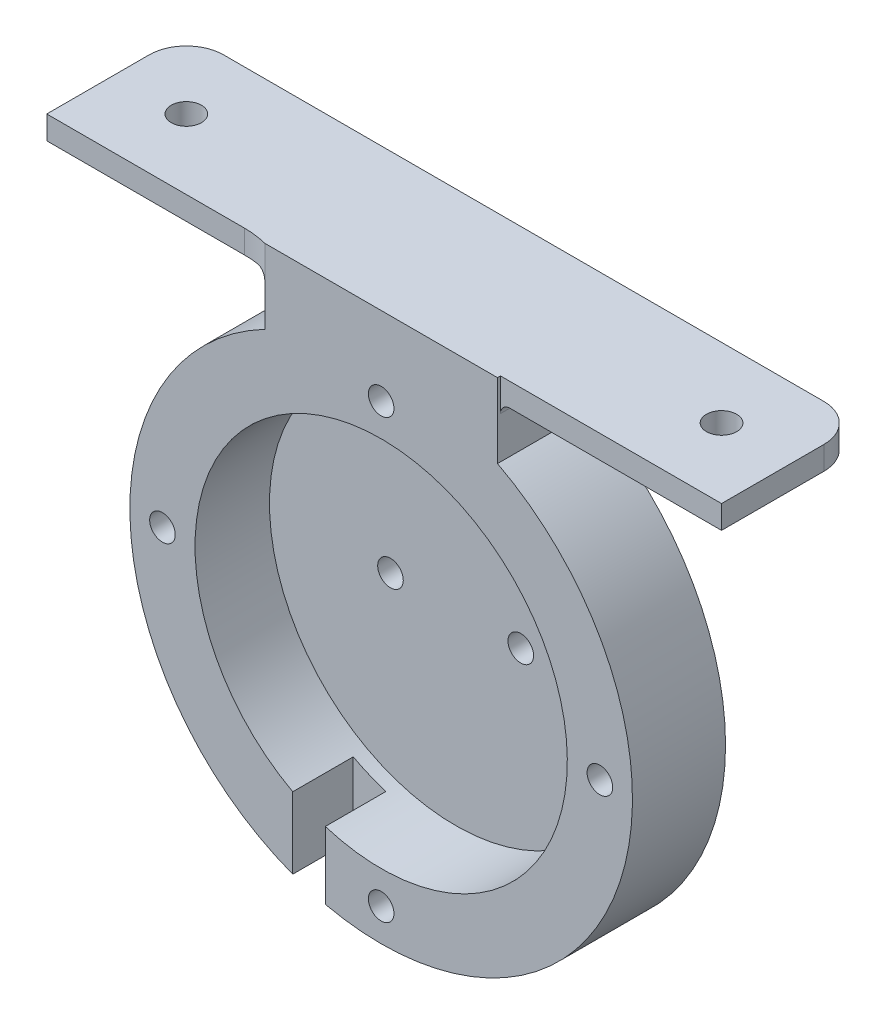
ISO-10303-21;
HEADER;
FILE_DESCRIPTION(('STEP AP214'),'2;1');
FILE_NAME('part.step','',(''),(''),'','','');
FILE_SCHEMA(('AUTOMOTIVE_DESIGN { 1 0 10303 214 1 1 1 1 }'));
ENDSEC;
DATA;
#1=APPLICATION_CONTEXT('core data for automotive mechanical design processes');
#2=APPLICATION_PROTOCOL_DEFINITION('international standard','automotive_design',2000,#1);
#3=PRODUCT_CONTEXT('',#1,'mechanical');
#4=PRODUCT('Part','Part','',(#3));
#5=PRODUCT_RELATED_PRODUCT_CATEGORY('part','',(#4));
#6=PRODUCT_DEFINITION_FORMATION('','',#4);
#7=PRODUCT_DEFINITION_CONTEXT('part definition',#1,'design');
#8=PRODUCT_DEFINITION('design','',#6,#7);
#9=PRODUCT_DEFINITION_SHAPE('','',#8);
#10=(LENGTH_UNIT() NAMED_UNIT(*) SI_UNIT(.MILLI.,.METRE.));
#11=(NAMED_UNIT(*) PLANE_ANGLE_UNIT() SI_UNIT($,.RADIAN.));
#12=(NAMED_UNIT(*) SI_UNIT($,.STERADIAN.) SOLID_ANGLE_UNIT());
#13=UNCERTAINTY_MEASURE_WITH_UNIT(LENGTH_MEASURE(1.E-05),#10,'distance_accuracy_value','');
#14=(GEOMETRIC_REPRESENTATION_CONTEXT(3) GLOBAL_UNCERTAINTY_ASSIGNED_CONTEXT((#13)) GLOBAL_UNIT_ASSIGNED_CONTEXT((#10,
#11,#12)) REPRESENTATION_CONTEXT('',''));
#15=CARTESIAN_POINT('',(0.,0.,0.));
#16=DIRECTION('',(0.,0.,1.));
#17=DIRECTION('',(1.,0.,0.));
#18=AXIS2_PLACEMENT_3D('',#15,#16,#17);
#19=CARTESIAN_POINT('',(-12.5,23.9321958875486,4.));
#20=DIRECTION('',(-1.,0.,0.));
#21=DIRECTION('',(0.,0.,1.));
#22=AXIS2_PLACEMENT_3D('',#19,#20,#21);
#23=PLANE('',#22);
#24=DIRECTION('',(0.,-1.,0.));
#25=VECTOR('',#24,1.);
#26=CARTESIAN_POINT('',(-12.5,23.9321958875486,10.));
#27=LINE('',#26,#25);
#28=CARTESIAN_POINT('',(-12.5,28.4321958875486,10.));
#29=VERTEX_POINT('',#28);
#30=CARTESIAN_POINT('',(-12.5,23.9321958875486,10.));
#31=VERTEX_POINT('',#30);
#32=EDGE_CURVE('E302',#29,#31,#27,.T.);
#33=ORIENTED_EDGE('',*,*,#32,.F.);
#34=DIRECTION('',(0.,0.,1.));
#35=VECTOR('',#34,1.);
#36=CARTESIAN_POINT('',(-12.5,28.4321958875486,4.));
#37=LINE('',#36,#35);
#38=CARTESIAN_POINT('',(-12.5,28.4321958875486,4.));
#39=VERTEX_POINT('',#38);
#40=EDGE_CURVE('E68',#29,#39,#37,.F.);
#41=ORIENTED_EDGE('',*,*,#40,.T.);
#42=DIRECTION('',(0.,-1.,0.));
#43=VECTOR('',#42,1.);
#44=CARTESIAN_POINT('',(-12.5,23.9321958875486,4.));
#45=LINE('',#44,#43);
#46=CARTESIAN_POINT('',(-12.5,23.9321958875486,4.));
#47=VERTEX_POINT('',#46);
#48=EDGE_CURVE('E303',#39,#47,#45,.T.);
#49=ORIENTED_EDGE('',*,*,#48,.T.);
#50=DIRECTION('',(0.,0.,1.));
#51=VECTOR('',#50,1.);
#52=CARTESIAN_POINT('',(-12.5,23.9321958875486,4.));
#53=LINE('',#52,#51);
#54=EDGE_CURVE('E311',#47,#31,#53,.T.);
#55=ORIENTED_EDGE('',*,*,#54,.T.);
#56=EDGE_LOOP('',(#33,#41,#49,#55));
#57=FACE_BOUND('',#56,.T.);
#58=ADVANCED_FACE('F42',(#57),#23,.T.);
#59=CARTESIAN_POINT('',(0.,0.,10.));
#60=DIRECTION('',(0.,0.,1.));
#61=DIRECTION('',(1.,0.,0.));
#62=AXIS2_PLACEMENT_3D('',#59,#60,#61);
#63=PLANE('',#62);
#64=DIRECTION('',(0.,1.,0.));
#65=VECTOR('',#64,1.);
#66=CARTESIAN_POINT('',(12.5,23.9321958875486,10.));
#67=LINE('',#66,#65);
#68=CARTESIAN_POINT('',(12.5,23.9321958875486,10.));
#69=VERTEX_POINT('',#68);
#70=CARTESIAN_POINT('',(12.5,31.9321958875486,10.));
#71=VERTEX_POINT('',#70);
#72=EDGE_CURVE('E314',#69,#71,#67,.T.);
#73=ORIENTED_EDGE('',*,*,#72,.T.);
#74=DIRECTION('',(-1.,0.,0.));
#75=VECTOR('',#74,1.);
#76=CARTESIAN_POINT('',(-12.5,31.9321958875486,10.));
#77=LINE('',#76,#75);
#78=CARTESIAN_POINT('',(-12.5,31.9321958875486,10.));
#79=VERTEX_POINT('',#78);
#80=EDGE_CURVE('E307',#71,#79,#77,.T.);
#81=ORIENTED_EDGE('',*,*,#80,.T.);
#82=EDGE_CURVE('E61',#79,#29,#27,.T.);
#83=ORIENTED_EDGE('',*,*,#82,.T.);
#84=ORIENTED_EDGE('',*,*,#32,.T.);
#85=CARTESIAN_POINT('',(0.,0.,10.));
#86=DIRECTION('',(0.,0.,1.));
#87=DIRECTION('',(1.,0.,0.));
#88=AXIS2_PLACEMENT_3D('',#85,#86,#87);
#89=CIRCLE('',#88,27.);
#90=CARTESIAN_POINT('',(-9.5,-25.2735039122002,10.));
#91=VERTEX_POINT('',#90);
#92=EDGE_CURVE('E383',#31,#91,#89,.T.);
#93=ORIENTED_EDGE('',*,*,#92,.T.);
#94=DIRECTION('',(0.,-1.,0.));
#95=VECTOR('',#94,1.);
#96=CARTESIAN_POINT('',(-9.5,0.,10.));
#97=LINE('',#96,#95);
#98=CARTESIAN_POINT('',(-9.5,-17.599715906798,10.));
#99=VERTEX_POINT('',#98);
#100=EDGE_CURVE('E299',#99,#91,#97,.T.);
#101=ORIENTED_EDGE('',*,*,#100,.F.);
#102=CARTESIAN_POINT('',(0.,0.,10.));
#103=DIRECTION('',(0.,0.,1.));
#104=DIRECTION('',(1.,0.,0.));
#105=AXIS2_PLACEMENT_3D('',#102,#103,#104);
#106=CIRCLE('',#105,20.);
#107=CARTESIAN_POINT('',(-6.,-19.0787840283389,10.));
#108=VERTEX_POINT('',#107);
#109=EDGE_CURVE('E367',#108,#99,#106,.T.);
#110=ORIENTED_EDGE('',*,*,#109,.F.);
#111=DIRECTION('',(0.,1.,0.));
#112=VECTOR('',#111,1.);
#113=CARTESIAN_POINT('',(-6.,0.,10.));
#114=LINE('',#113,#112);
#115=CARTESIAN_POINT('',(-6.,-26.3248931621764,10.));
#116=VERTEX_POINT('',#115);
#117=EDGE_CURVE('E290',#116,#108,#114,.T.);
#118=ORIENTED_EDGE('',*,*,#117,.F.);
#119=EDGE_CURVE('E388',#116,#69,#89,.T.);
#120=ORIENTED_EDGE('',*,*,#119,.T.);
#121=EDGE_LOOP('',(#73,#81,#83,#84,#93,#101,#110,#118,#120));
#122=FACE_BOUND('',#121,.T.);
#123=CARTESIAN_POINT('',(1.327186583295E-12,-23.5,10.));
#124=DIRECTION('',(0.,0.,1.));
#125=DIRECTION('',(1.,0.,0.));
#126=AXIS2_PLACEMENT_3D('',#123,#124,#125);
#127=CIRCLE('',#126,1.375);
#128=CARTESIAN_POINT('',(1.37500000000133,-23.5,10.));
#129=VERTEX_POINT('',#128);
#130=EDGE_CURVE('E355',#129,#129,#127,.T.);
#131=ORIENTED_EDGE('',*,*,#130,.F.);
#132=EDGE_LOOP('',(#131));
#133=FACE_BOUND('',#132,.T.);
#134=CARTESIAN_POINT('',(0.,23.5,10.));
#135=DIRECTION('',(0.,0.,1.));
#136=DIRECTION('',(1.,0.,0.));
#137=AXIS2_PLACEMENT_3D('',#134,#135,#136);
#138=CIRCLE('',#137,1.375);
#139=CARTESIAN_POINT('',(1.375,23.5,10.));
#140=VERTEX_POINT('',#139);
#141=EDGE_CURVE('E375',#140,#140,#138,.T.);
#142=ORIENTED_EDGE('',*,*,#141,.F.);
#143=EDGE_LOOP('',(#142));
#144=FACE_BOUND('',#143,.T.);
#145=CARTESIAN_POINT('',(23.5000000000007,6.635932916475E-13,10.));
#146=DIRECTION('',(0.,0.,1.));
#147=DIRECTION('',(1.,0.,0.));
#148=AXIS2_PLACEMENT_3D('',#145,#146,#147);
#149=CIRCLE('',#148,1.375);
#150=CARTESIAN_POINT('',(24.8750000000007,6.635932916475E-13,10.));
#151=VERTEX_POINT('',#150);
#152=EDGE_CURVE('E363',#151,#151,#149,.T.);
#153=ORIENTED_EDGE('',*,*,#152,.F.);
#154=EDGE_LOOP('',(#153));
#155=FACE_BOUND('',#154,.T.);
#156=CARTESIAN_POINT('',(-23.4999999999993,-6.66471211625496E-13,10.));
#157=DIRECTION('',(0.,0.,1.));
#158=DIRECTION('',(1.,0.,0.));
#159=AXIS2_PLACEMENT_3D('',#156,#157,#158);
#160=CIRCLE('',#159,1.375);
#161=CARTESIAN_POINT('',(-22.1249999999993,-6.66471211625496E-13,10.));
#162=VERTEX_POINT('',#161);
#163=EDGE_CURVE('E347',#162,#162,#160,.T.);
#164=ORIENTED_EDGE('',*,*,#163,.F.);
#165=EDGE_LOOP('',(#164));
#166=FACE_BOUND('',#165,.T.);
#167=ADVANCED_FACE('F465',(#122,#133,#144,#155,#166),#63,.T.);
#168=CARTESIAN_POINT('',(0.,0.,0.));
#169=DIRECTION('',(0.,0.,1.));
#170=DIRECTION('',(1.,0.,0.));
#171=AXIS2_PLACEMENT_3D('',#168,#169,#170);
#172=PLANE('',#171);
#173=CARTESIAN_POINT('',(0.,0.,0.));
#174=DIRECTION('',(0.,0.,1.));
#175=DIRECTION('',(1.,0.,0.));
#176=AXIS2_PLACEMENT_3D('',#173,#174,#175);
#177=CIRCLE('',#176,27.);
#178=CARTESIAN_POINT('',(27.,0.,0.));
#179=VERTEX_POINT('',#178);
#180=EDGE_CURVE('E379',#179,#179,#177,.T.);
#181=ORIENTED_EDGE('',*,*,#180,.F.);
#182=EDGE_LOOP('',(#181));
#183=FACE_BOUND('',#182,.T.);
#184=CARTESIAN_POINT('',(0.,23.5,0.));
#185=DIRECTION('',(0.,0.,1.));
#186=DIRECTION('',(1.,0.,0.));
#187=AXIS2_PLACEMENT_3D('',#184,#185,#186);
#188=CIRCLE('',#187,1.375);
#189=CARTESIAN_POINT('',(1.375,23.5,0.));
#190=VERTEX_POINT('',#189);
#191=EDGE_CURVE('E374',#190,#190,#188,.T.);
#192=ORIENTED_EDGE('',*,*,#191,.T.);
#193=EDGE_LOOP('',(#192));
#194=FACE_BOUND('',#193,.T.);
#195=CARTESIAN_POINT('',(23.5000000000007,6.635932916475E-13,0.));
#196=DIRECTION('',(0.,0.,1.));
#197=DIRECTION('',(1.,0.,0.));
#198=AXIS2_PLACEMENT_3D('',#195,#196,#197);
#199=CIRCLE('',#198,1.375);
#200=CARTESIAN_POINT('',(24.8750000000007,6.635932916475E-13,0.));
#201=VERTEX_POINT('',#200);
#202=EDGE_CURVE('E359',#201,#201,#199,.T.);
#203=ORIENTED_EDGE('',*,*,#202,.T.);
#204=EDGE_LOOP('',(#203));
#205=FACE_BOUND('',#204,.T.);
#206=CARTESIAN_POINT('',(1.327186583295E-12,-23.5,0.));
#207=DIRECTION('',(0.,0.,1.));
#208=DIRECTION('',(1.,0.,0.));
#209=AXIS2_PLACEMENT_3D('',#206,#207,#208);
#210=CIRCLE('',#209,1.375);
#211=CARTESIAN_POINT('',(1.37500000000133,-23.5,0.));
#212=VERTEX_POINT('',#211);
#213=EDGE_CURVE('E351',#212,#212,#210,.T.);
#214=ORIENTED_EDGE('',*,*,#213,.T.);
#215=EDGE_LOOP('',(#214));
#216=FACE_BOUND('',#215,.T.);
#217=CARTESIAN_POINT('',(-23.4999999999993,-6.66471211625496E-13,0.));
#218=DIRECTION('',(0.,0.,1.));
#219=DIRECTION('',(1.,0.,0.));
#220=AXIS2_PLACEMENT_3D('',#217,#218,#219);
#221=CIRCLE('',#220,1.375);
#222=CARTESIAN_POINT('',(-22.1249999999993,-6.66471211625496E-13,0.));
#223=VERTEX_POINT('',#222);
#224=EDGE_CURVE('E343',#223,#223,#221,.T.);
#225=ORIENTED_EDGE('',*,*,#224,.T.);
#226=EDGE_LOOP('',(#225));
#227=FACE_BOUND('',#226,.T.);
#228=CARTESIAN_POINT('',(-7.,0.,0.));
#229=DIRECTION('',(0.,0.,1.));
#230=DIRECTION('',(1.,0.,0.));
#231=AXIS2_PLACEMENT_3D('',#228,#229,#230);
#232=CIRCLE('',#231,1.375);
#233=CARTESIAN_POINT('',(-5.625,0.,0.));
#234=VERTEX_POINT('',#233);
#235=EDGE_CURVE('E335',#234,#234,#232,.T.);
#236=ORIENTED_EDGE('',*,*,#235,.T.);
#237=EDGE_LOOP('',(#236));
#238=FACE_BOUND('',#237,.T.);
#239=CARTESIAN_POINT('',(7.,0.,0.));
#240=DIRECTION('',(0.,0.,1.));
#241=DIRECTION('',(1.,0.,0.));
#242=AXIS2_PLACEMENT_3D('',#239,#240,#241);
#243=CIRCLE('',#242,1.375);
#244=CARTESIAN_POINT('',(8.375,0.,0.));
#245=VERTEX_POINT('',#244);
#246=EDGE_CURVE('E323',#245,#245,#243,.T.);
#247=ORIENTED_EDGE('',*,*,#246,.T.);
#248=EDGE_LOOP('',(#247));
#249=FACE_BOUND('',#248,.T.);
#250=ADVANCED_FACE('F470',(#183,#194,#205,#216,#227,#238,#249),#172,.F.);
#251=CARTESIAN_POINT('',(0.,0.,10.));
#252=DIRECTION('',(0.,0.,-1.));
#253=DIRECTION('',(-1.,0.,0.));
#254=AXIS2_PLACEMENT_3D('',#251,#252,#253);
#255=CYLINDRICAL_SURFACE('',#254,27.);
#256=CARTESIAN_POINT('',(0.,0.,3.49999999999996));
#257=DIRECTION('',(0.,0.,-1.));
#258=DIRECTION('',(-1.,0.,0.));
#259=AXIS2_PLACEMENT_3D('',#256,#257,#258);
#260=CIRCLE('',#259,27.);
#261=CARTESIAN_POINT('',(-9.5,-25.2735039122002,3.49999999999996));
#262=VERTEX_POINT('',#261);
#263=CARTESIAN_POINT('',(-6.,-26.3248931621764,3.49999999999996));
#264=VERTEX_POINT('',#263);
#265=EDGE_CURVE('E283',#262,#264,#260,.F.);
#266=ORIENTED_EDGE('',*,*,#265,.F.);
#267=DIRECTION('',(0.,0.,-1.));
#268=VECTOR('',#267,1.);
#269=CARTESIAN_POINT('',(-9.5,-25.2735039122002,10.));
#270=LINE('',#269,#268);
#271=EDGE_CURVE('E287',#91,#262,#270,.T.);
#272=ORIENTED_EDGE('',*,*,#271,.F.);
#273=ORIENTED_EDGE('',*,*,#92,.F.);
#274=ORIENTED_EDGE('',*,*,#54,.F.);
#275=CARTESIAN_POINT('',(0.,0.,4.));
#276=DIRECTION('',(0.,0.,-1.));
#277=DIRECTION('',(-1.,0.,0.));
#278=AXIS2_PLACEMENT_3D('',#275,#276,#277);
#279=CIRCLE('',#278,27.);
#280=CARTESIAN_POINT('',(12.5,23.9321958875486,4.));
#281=VERTEX_POINT('',#280);
#282=EDGE_CURVE('E395',#47,#281,#279,.T.);
#283=ORIENTED_EDGE('',*,*,#282,.T.);
#284=DIRECTION('',(0.,0.,1.));
#285=VECTOR('',#284,1.);
#286=CARTESIAN_POINT('',(12.5,23.9321958875486,4.));
#287=LINE('',#286,#285);
#288=EDGE_CURVE('E324',#281,#69,#287,.T.);
#289=ORIENTED_EDGE('',*,*,#288,.T.);
#290=ORIENTED_EDGE('',*,*,#119,.F.);
#291=DIRECTION('',(0.,0.,-1.));
#292=VECTOR('',#291,1.);
#293=CARTESIAN_POINT('',(-6.,-26.3248931621764,10.));
#294=LINE('',#293,#292);
#295=EDGE_CURVE('E280',#264,#116,#294,.F.);
#296=ORIENTED_EDGE('',*,*,#295,.F.);
#297=EDGE_LOOP('',(#266,#272,#273,#274,#283,#289,#290,#296));
#298=FACE_BOUND('',#297,.T.);
#299=ORIENTED_EDGE('',*,*,#180,.T.);
#300=EDGE_LOOP('',(#299));
#301=FACE_BOUND('',#300,.T.);
#302=ADVANCED_FACE('F450',(#298,#301),#255,.T.);
#303=CARTESIAN_POINT('',(0.,23.5,10.));
#304=DIRECTION('',(0.,0.,-1.));
#305=DIRECTION('',(-1.,0.,0.));
#306=AXIS2_PLACEMENT_3D('',#303,#304,#305);
#307=CYLINDRICAL_SURFACE('',#306,1.375);
#308=ORIENTED_EDGE('',*,*,#141,.T.);
#309=EDGE_LOOP('',(#308));
#310=FACE_BOUND('',#309,.T.);
#311=ORIENTED_EDGE('',*,*,#191,.F.);
#312=EDGE_LOOP('',(#311));
#313=FACE_BOUND('',#312,.T.);
#314=ADVANCED_FACE('F504',(#310,#313),#307,.F.);
#315=CARTESIAN_POINT('',(0.,0.,10.));
#316=DIRECTION('',(0.,0.,-1.));
#317=DIRECTION('',(-1.,0.,0.));
#318=AXIS2_PLACEMENT_3D('',#315,#316,#317);
#319=CYLINDRICAL_SURFACE('',#318,20.);
#320=DIRECTION('',(0.,0.,-1.));
#321=VECTOR('',#320,1.);
#322=CARTESIAN_POINT('',(-9.5,-17.599715906798,10.));
#323=LINE('',#322,#321);
#324=CARTESIAN_POINT('',(-9.5,-17.599715906798,3.49999999999996));
#325=VERTEX_POINT('',#324);
#326=EDGE_CURVE('E405',#325,#99,#323,.F.);
#327=ORIENTED_EDGE('',*,*,#326,.F.);
#328=CARTESIAN_POINT('',(0.,0.,3.49999999999996));
#329=DIRECTION('',(0.,0.,-1.));
#330=DIRECTION('',(-1.,0.,0.));
#331=AXIS2_PLACEMENT_3D('',#328,#329,#330);
#332=CIRCLE('',#331,20.);
#333=CARTESIAN_POINT('',(-6.,-19.0787840283389,3.49999999999996));
#334=VERTEX_POINT('',#333);
#335=EDGE_CURVE('E402',#334,#325,#332,.T.);
#336=ORIENTED_EDGE('',*,*,#335,.F.);
#337=DIRECTION('',(0.,0.,-1.));
#338=VECTOR('',#337,1.);
#339=CARTESIAN_POINT('',(-6.,-19.0787840283389,10.));
#340=LINE('',#339,#338);
#341=EDGE_CURVE('E399',#108,#334,#340,.T.);
#342=ORIENTED_EDGE('',*,*,#341,.F.);
#343=ORIENTED_EDGE('',*,*,#109,.T.);
#344=EDGE_LOOP('',(#327,#336,#342,#343));
#345=FACE_BOUND('',#344,.T.);
#346=CARTESIAN_POINT('',(0.,0.,2.));
#347=DIRECTION('',(0.,0.,1.));
#348=DIRECTION('',(1.,0.,0.));
#349=AXIS2_PLACEMENT_3D('',#346,#347,#348);
#350=CIRCLE('',#349,20.);
#351=CARTESIAN_POINT('',(20.,0.,2.));
#352=VERTEX_POINT('',#351);
#353=EDGE_CURVE('E387',#352,#352,#350,.T.);
#354=ORIENTED_EDGE('',*,*,#353,.F.);
#355=EDGE_LOOP('',(#354));
#356=FACE_BOUND('',#355,.T.);
#357=ADVANCED_FACE('F500',(#345,#356),#319,.F.);
#358=CARTESIAN_POINT('',(23.5000000000007,6.635932916475E-13,10.));
#359=DIRECTION('',(0.,0.,-1.));
#360=DIRECTION('',(-1.,0.,0.));
#361=AXIS2_PLACEMENT_3D('',#358,#359,#360);
#362=CYLINDRICAL_SURFACE('',#361,1.375);
#363=ORIENTED_EDGE('',*,*,#152,.T.);
#364=EDGE_LOOP('',(#363));
#365=FACE_BOUND('',#364,.T.);
#366=ORIENTED_EDGE('',*,*,#202,.F.);
#367=EDGE_LOOP('',(#366));
#368=FACE_BOUND('',#367,.T.);
#369=ADVANCED_FACE('F496',(#365,#368),#362,.F.);
#370=CARTESIAN_POINT('',(1.327186583295E-12,-23.5,10.));
#371=DIRECTION('',(0.,0.,-1.));
#372=DIRECTION('',(-1.,0.,0.));
#373=AXIS2_PLACEMENT_3D('',#370,#371,#372);
#374=CYLINDRICAL_SURFACE('',#373,1.375);
#375=ORIENTED_EDGE('',*,*,#130,.T.);
#376=EDGE_LOOP('',(#375));
#377=FACE_BOUND('',#376,.T.);
#378=ORIENTED_EDGE('',*,*,#213,.F.);
#379=EDGE_LOOP('',(#378));
#380=FACE_BOUND('',#379,.T.);
#381=ADVANCED_FACE('F492',(#377,#380),#374,.F.);
#382=CARTESIAN_POINT('',(-23.4999999999993,-6.66471211625496E-13,10.));
#383=DIRECTION('',(0.,0.,-1.));
#384=DIRECTION('',(-1.,0.,0.));
#385=AXIS2_PLACEMENT_3D('',#382,#383,#384);
#386=CYLINDRICAL_SURFACE('',#385,1.375);
#387=ORIENTED_EDGE('',*,*,#163,.T.);
#388=EDGE_LOOP('',(#387));
#389=FACE_BOUND('',#388,.T.);
#390=ORIENTED_EDGE('',*,*,#224,.F.);
#391=EDGE_LOOP('',(#390));
#392=FACE_BOUND('',#391,.T.);
#393=ADVANCED_FACE('F488',(#389,#392),#386,.F.);
#394=CARTESIAN_POINT('',(0.,0.,2.));
#395=DIRECTION('',(0.,0.,1.));
#396=DIRECTION('',(1.,0.,0.));
#397=AXIS2_PLACEMENT_3D('',#394,#395,#396);
#398=PLANE('',#397);
#399=CARTESIAN_POINT('',(-7.,0.,2.));
#400=DIRECTION('',(0.,0.,1.));
#401=DIRECTION('',(1.,0.,0.));
#402=AXIS2_PLACEMENT_3D('',#399,#400,#401);
#403=CIRCLE('',#402,1.375);
#404=CARTESIAN_POINT('',(-5.625,0.,2.));
#405=VERTEX_POINT('',#404);
#406=EDGE_CURVE('E339',#405,#405,#403,.T.);
#407=ORIENTED_EDGE('',*,*,#406,.F.);
#408=EDGE_LOOP('',(#407));
#409=FACE_BOUND('',#408,.T.);
#410=ORIENTED_EDGE('',*,*,#353,.T.);
#411=EDGE_LOOP('',(#410));
#412=FACE_BOUND('',#411,.T.);
#413=CARTESIAN_POINT('',(7.,0.,2.));
#414=DIRECTION('',(0.,0.,1.));
#415=DIRECTION('',(1.,0.,0.));
#416=AXIS2_PLACEMENT_3D('',#413,#414,#415);
#417=CIRCLE('',#416,1.375);
#418=CARTESIAN_POINT('',(8.375,0.,2.));
#419=VERTEX_POINT('',#418);
#420=EDGE_CURVE('E331',#419,#419,#417,.T.);
#421=ORIENTED_EDGE('',*,*,#420,.F.);
#422=EDGE_LOOP('',(#421));
#423=FACE_BOUND('',#422,.T.);
#424=ADVANCED_FACE('F484',(#409,#412,#423),#398,.T.);
#425=CARTESIAN_POINT('',(-7.,0.,2.));
#426=DIRECTION('',(0.,0.,-1.));
#427=DIRECTION('',(-1.,0.,0.));
#428=AXIS2_PLACEMENT_3D('',#425,#426,#427);
#429=CYLINDRICAL_SURFACE('',#428,1.375);
#430=ORIENTED_EDGE('',*,*,#406,.T.);
#431=EDGE_LOOP('',(#430));
#432=FACE_BOUND('',#431,.T.);
#433=ORIENTED_EDGE('',*,*,#235,.F.);
#434=EDGE_LOOP('',(#433));
#435=FACE_BOUND('',#434,.T.);
#436=ADVANCED_FACE('F480',(#432,#435),#429,.F.);
#437=CARTESIAN_POINT('',(7.,0.,2.));
#438=DIRECTION('',(0.,0.,-1.));
#439=DIRECTION('',(-1.,0.,0.));
#440=AXIS2_PLACEMENT_3D('',#437,#438,#439);
#441=CYLINDRICAL_SURFACE('',#440,1.375);
#442=ORIENTED_EDGE('',*,*,#420,.T.);
#443=EDGE_LOOP('',(#442));
#444=FACE_BOUND('',#443,.T.);
#445=ORIENTED_EDGE('',*,*,#246,.F.);
#446=EDGE_LOOP('',(#445));
#447=FACE_BOUND('',#446,.T.);
#448=ADVANCED_FACE('F476',(#444,#447),#441,.F.);
#449=CARTESIAN_POINT('',(-12.5,31.9321958875486,4.));
#450=DIRECTION('',(0.,1.,0.));
#451=DIRECTION('',(0.,0.,1.));
#452=AXIS2_PLACEMENT_3D('',#449,#450,#451);
#453=PLANE('',#452);
#454=DIRECTION('',(-1.,0.,0.));
#455=VECTOR('',#454,1.);
#456=CARTESIAN_POINT('',(-12.5,31.9321958875486,-5.32));
#457=LINE('',#456,#455);
#458=CARTESIAN_POINT('',(32.25,31.9321958875486,-5.32));
#459=VERTEX_POINT('',#458);
#460=CARTESIAN_POINT('',(-32.25,31.9321958875486,-5.32));
#461=VERTEX_POINT('',#460);
#462=EDGE_CURVE('E191',#459,#461,#457,.T.);
#463=ORIENTED_EDGE('',*,*,#462,.T.);
#464=CARTESIAN_POINT('',(-32.25,31.9321958875486,-1.31999999999999));
#465=DIRECTION('',(0.,1.,0.));
#466=DIRECTION('',(0.,0.,1.));
#467=AXIS2_PLACEMENT_3D('',#464,#465,#466);
#468=CIRCLE('',#467,3.99999999999999);
#469=CARTESIAN_POINT('',(-36.25,31.9321958875486,-1.31999999999999));
#470=VERTEX_POINT('',#469);
#471=EDGE_CURVE('E259',#470,#461,#468,.F.);
#472=ORIENTED_EDGE('',*,*,#471,.F.);
#473=DIRECTION('',(0.,0.,1.));
#474=VECTOR('',#473,1.);
#475=CARTESIAN_POINT('',(-36.25,31.9321958875486,0.));
#476=LINE('',#475,#474);
#477=CARTESIAN_POINT('',(-36.25,31.9321958875486,9.68000000000001));
#478=VERTEX_POINT('',#477);
#479=EDGE_CURVE('E263',#470,#478,#476,.T.);
#480=ORIENTED_EDGE('',*,*,#479,.T.);
#481=DIRECTION('',(-1.,0.,0.));
#482=VECTOR('',#481,1.);
#483=CARTESIAN_POINT('',(0.,31.9321958875486,9.67999999999999));
#484=LINE('',#483,#482);
#485=CARTESIAN_POINT('',(-15.0095019426173,31.9321958875486,9.67999999999999));
#486=VERTEX_POINT('',#485);
#487=EDGE_CURVE('E245',#486,#478,#484,.T.);
#488=ORIENTED_EDGE('',*,*,#487,.F.);
#489=CARTESIAN_POINT('',(-15.0095019426173,31.9321958875486,19.68));
#490=DIRECTION('',(0.,1.,0.));
#491=DIRECTION('',(0.,0.,1.));
#492=AXIS2_PLACEMENT_3D('',#489,#490,#491);
#493=CIRCLE('',#492,10.);
#494=EDGE_CURVE('E412',#486,#79,#493,.F.);
#495=ORIENTED_EDGE('',*,*,#494,.T.);
#496=ORIENTED_EDGE('',*,*,#80,.F.);
#497=DIRECTION('',(0.,0.,1.));
#498=VECTOR('',#497,1.);
#499=CARTESIAN_POINT('',(12.5,31.9321958875486,4.));
#500=LINE('',#499,#498);
#501=CARTESIAN_POINT('',(12.5,31.9321958875486,9.68000000000001));
#502=VERTEX_POINT('',#501);
#503=EDGE_CURVE('E320',#502,#71,#500,.T.);
#504=ORIENTED_EDGE('',*,*,#503,.F.);
#505=DIRECTION('',(1.,0.,0.));
#506=VECTOR('',#505,1.);
#507=CARTESIAN_POINT('',(0.,31.9321958875486,9.67999999999999));
#508=LINE('',#507,#506);
#509=CARTESIAN_POINT('',(36.25,31.9321958875486,9.68000000000001));
#510=VERTEX_POINT('',#509);
#511=EDGE_CURVE('E226',#502,#510,#508,.T.);
#512=ORIENTED_EDGE('',*,*,#511,.T.);
#513=DIRECTION('',(0.,0.,1.));
#514=VECTOR('',#513,1.);
#515=CARTESIAN_POINT('',(36.25,31.9321958875486,0.));
#516=LINE('',#515,#514);
#517=CARTESIAN_POINT('',(36.25,31.9321958875486,-1.31999999999999));
#518=VERTEX_POINT('',#517);
#519=EDGE_CURVE('E214',#518,#510,#516,.T.);
#520=ORIENTED_EDGE('',*,*,#519,.F.);
#521=CARTESIAN_POINT('',(32.25,31.9321958875486,-1.31999999999999));
#522=DIRECTION('',(0.,-1.,0.));
#523=DIRECTION('',(0.,0.,1.));
#524=AXIS2_PLACEMENT_3D('',#521,#522,#523);
#525=CIRCLE('',#524,3.99999999999999);
#526=EDGE_CURVE('E223',#518,#459,#525,.F.);
#527=ORIENTED_EDGE('',*,*,#526,.T.);
#528=EDGE_LOOP('',(#463,#472,#480,#488,#495,#496,#504,#512,#520,#527));
#529=FACE_BOUND('',#528,.T.);
#530=CARTESIAN_POINT('',(-28.75,31.9321958875486,2.18));
#531=DIRECTION('',(0.,1.,0.));
#532=DIRECTION('',(0.,0.,1.));
#533=AXIS2_PLACEMENT_3D('',#530,#531,#532);
#534=CIRCLE('',#533,1.625);
#535=CARTESIAN_POINT('',(-28.75,31.9321958875486,3.805));
#536=VERTEX_POINT('',#535);
#537=EDGE_CURVE('E235',#536,#536,#534,.T.);
#538=ORIENTED_EDGE('',*,*,#537,.F.);
#539=EDGE_LOOP('',(#538));
#540=FACE_BOUND('',#539,.T.);
#541=CARTESIAN_POINT('',(28.75,31.9321958875486,2.18));
#542=DIRECTION('',(0.,-1.,0.));
#543=DIRECTION('',(0.,0.,1.));
#544=AXIS2_PLACEMENT_3D('',#541,#542,#543);
#545=CIRCLE('',#544,1.625);
#546=CARTESIAN_POINT('',(28.75,31.9321958875486,3.805));
#547=VERTEX_POINT('',#546);
#548=EDGE_CURVE('E219',#547,#547,#545,.T.);
#549=ORIENTED_EDGE('',*,*,#548,.T.);
#550=EDGE_LOOP('',(#549));
#551=FACE_BOUND('',#550,.T.);
#552=ADVANCED_FACE('F479',(#529,#540,#551),#453,.T.);
#553=CARTESIAN_POINT('',(12.5,23.9321958875486,4.));
#554=DIRECTION('',(1.,0.,0.));
#555=DIRECTION('',(0.,0.,-1.));
#556=AXIS2_PLACEMENT_3D('',#553,#554,#555);
#557=PLANE('',#556);
#558=DIRECTION('',(0.,1.,0.));
#559=VECTOR('',#558,1.);
#560=CARTESIAN_POINT('',(12.5,23.9321958875486,4.));
#561=LINE('',#560,#559);
#562=CARTESIAN_POINT('',(12.5,28.4321958875486,4.));
#563=VERTEX_POINT('',#562);
#564=EDGE_CURVE('E306',#281,#563,#561,.T.);
#565=ORIENTED_EDGE('',*,*,#564,.T.);
#566=DIRECTION('',(0.,0.,1.));
#567=VECTOR('',#566,1.);
#568=CARTESIAN_POINT('',(12.5,28.4321958875486,9.68000000000001));
#569=LINE('',#568,#567);
#570=CARTESIAN_POINT('',(12.5,28.4321958875486,9.68));
#571=VERTEX_POINT('',#570);
#572=EDGE_CURVE('E418',#563,#571,#569,.T.);
#573=ORIENTED_EDGE('',*,*,#572,.T.);
#574=DIRECTION('',(0.,1.,0.));
#575=VECTOR('',#574,1.);
#576=CARTESIAN_POINT('',(12.5,29.4321958875486,9.68));
#577=LINE('',#576,#575);
#578=EDGE_CURVE('E200',#571,#502,#577,.T.);
#579=ORIENTED_EDGE('',*,*,#578,.T.);
#580=ORIENTED_EDGE('',*,*,#503,.T.);
#581=ORIENTED_EDGE('',*,*,#72,.F.);
#582=ORIENTED_EDGE('',*,*,#288,.F.);
#583=EDGE_LOOP('',(#565,#573,#579,#580,#581,#582));
#584=FACE_BOUND('',#583,.T.);
#585=ADVANCED_FACE('F474',(#584),#557,.T.);
#586=CARTESIAN_POINT('',(0.,0.,4.));
#587=DIRECTION('',(0.,0.,-1.));
#588=DIRECTION('',(-1.,0.,0.));
#589=AXIS2_PLACEMENT_3D('',#586,#587,#588);
#590=PLANE('',#589);
#591=ORIENTED_EDGE('',*,*,#48,.F.);
#592=DIRECTION('',(-1.,0.,0.));
#593=VECTOR('',#592,1.);
#594=CARTESIAN_POINT('',(12.5,28.4321958875486,4.));
#595=LINE('',#594,#593);
#596=EDGE_CURVE('E431',#39,#563,#595,.F.);
#597=ORIENTED_EDGE('',*,*,#596,.T.);
#598=ORIENTED_EDGE('',*,*,#564,.F.);
#599=ORIENTED_EDGE('',*,*,#282,.F.);
#600=EDGE_LOOP('',(#591,#597,#598,#599));
#601=FACE_BOUND('',#600,.T.);
#602=ADVANCED_FACE('F558',(#601),#590,.T.);
#603=CARTESIAN_POINT('',(-9.5,-27.001,3.49999999999996));
#604=DIRECTION('',(-1.,0.,0.));
#605=DIRECTION('',(0.,0.,1.));
#606=AXIS2_PLACEMENT_3D('',#603,#604,#605);
#607=PLANE('',#606);
#608=ORIENTED_EDGE('',*,*,#100,.T.);
#609=ORIENTED_EDGE('',*,*,#271,.T.);
#610=DIRECTION('',(0.,1.,0.));
#611=VECTOR('',#610,1.);
#612=CARTESIAN_POINT('',(-9.5,-27.001,3.49999999999996));
#613=LINE('',#612,#611);
#614=EDGE_CURVE('E284',#262,#325,#613,.T.);
#615=ORIENTED_EDGE('',*,*,#614,.T.);
#616=ORIENTED_EDGE('',*,*,#326,.T.);
#617=EDGE_LOOP('',(#608,#609,#615,#616));
#618=FACE_BOUND('',#617,.T.);
#619=ADVANCED_FACE('F556',(#618),#607,.F.);
#620=CARTESIAN_POINT('',(-9.5,-27.001,3.49999999999996));
#621=DIRECTION('',(0.,0.,-1.));
#622=DIRECTION('',(-1.,0.,0.));
#623=AXIS2_PLACEMENT_3D('',#620,#621,#622);
#624=PLANE('',#623);
#625=ORIENTED_EDGE('',*,*,#335,.T.);
#626=ORIENTED_EDGE('',*,*,#614,.F.);
#627=ORIENTED_EDGE('',*,*,#265,.T.);
#628=DIRECTION('',(0.,1.,0.));
#629=VECTOR('',#628,1.);
#630=CARTESIAN_POINT('',(-6.,-27.001,3.49999999999996));
#631=LINE('',#630,#629);
#632=EDGE_CURVE('E190',#264,#334,#631,.T.);
#633=ORIENTED_EDGE('',*,*,#632,.T.);
#634=EDGE_LOOP('',(#625,#626,#627,#633));
#635=FACE_BOUND('',#634,.T.);
#636=ADVANCED_FACE('F544',(#635),#624,.F.);
#637=CARTESIAN_POINT('',(-6.,-27.001,3.49999999999996));
#638=DIRECTION('',(1.,0.,0.));
#639=DIRECTION('',(0.,0.,-1.));
#640=AXIS2_PLACEMENT_3D('',#637,#638,#639);
#641=PLANE('',#640);
#642=ORIENTED_EDGE('',*,*,#117,.T.);
#643=ORIENTED_EDGE('',*,*,#341,.T.);
#644=ORIENTED_EDGE('',*,*,#632,.F.);
#645=ORIENTED_EDGE('',*,*,#295,.T.);
#646=EDGE_LOOP('',(#642,#643,#644,#645));
#647=FACE_BOUND('',#646,.T.);
#648=ADVANCED_FACE('F547',(#647),#641,.F.);
#649=CARTESIAN_POINT('',(-12.5,29.4321958875486,-5.32));
#650=DIRECTION('',(0.,0.,-1.));
#651=DIRECTION('',(-1.,0.,0.));
#652=AXIS2_PLACEMENT_3D('',#649,#650,#651);
#653=PLANE('',#652);
#654=DIRECTION('',(-1.,0.,0.));
#655=VECTOR('',#654,1.);
#656=CARTESIAN_POINT('',(-12.5,29.4321958875486,-5.32));
#657=LINE('',#656,#655);
#658=CARTESIAN_POINT('',(32.25,29.4321958875486,-5.32));
#659=VERTEX_POINT('',#658);
#660=CARTESIAN_POINT('',(-32.25,29.4321958875486,-5.32));
#661=VERTEX_POINT('',#660);
#662=EDGE_CURVE('E175',#659,#661,#657,.T.);
#663=ORIENTED_EDGE('',*,*,#662,.T.);
#664=DIRECTION('',(0.,1.,0.));
#665=VECTOR('',#664,1.);
#666=CARTESIAN_POINT('',(-32.25,29.4321958875486,-5.32));
#667=LINE('',#666,#665);
#668=EDGE_CURVE('E269',#661,#461,#667,.T.);
#669=ORIENTED_EDGE('',*,*,#668,.T.);
#670=ORIENTED_EDGE('',*,*,#462,.F.);
#671=DIRECTION('',(0.,1.,0.));
#672=VECTOR('',#671,1.);
#673=CARTESIAN_POINT('',(32.25,29.4321958875486,-5.32));
#674=LINE('',#673,#672);
#675=EDGE_CURVE('E194',#659,#459,#674,.T.);
#676=ORIENTED_EDGE('',*,*,#675,.F.);
#677=EDGE_LOOP('',(#663,#669,#670,#676));
#678=FACE_BOUND('',#677,.T.);
#679=ADVANCED_FACE('F195',(#678),#653,.T.);
#680=CARTESIAN_POINT('',(0.,29.4321958875486,0.));
#681=DIRECTION('',(0.,-1.,0.));
#682=DIRECTION('',(0.,0.,-1.));
#683=AXIS2_PLACEMENT_3D('',#680,#681,#682);
#684=PLANE('',#683);
#685=DIRECTION('',(1.,0.,0.));
#686=VECTOR('',#685,1.);
#687=CARTESIAN_POINT('',(0.,29.4321958875486,9.67999999999999));
#688=LINE('',#687,#686);
#689=CARTESIAN_POINT('',(13.5,29.4321958875486,9.67999999999999));
#690=VERTEX_POINT('',#689);
#691=CARTESIAN_POINT('',(36.25,29.4321958875486,9.68000000000001));
#692=VERTEX_POINT('',#691);
#693=EDGE_CURVE('E207',#690,#692,#688,.T.);
#694=ORIENTED_EDGE('',*,*,#693,.F.);
#695=DIRECTION('',(0.,0.,1.));
#696=VECTOR('',#695,1.);
#697=CARTESIAN_POINT('',(13.5,29.4321958875486,4.));
#698=LINE('',#697,#696);
#699=CARTESIAN_POINT('',(13.5,29.4321958875486,3.));
#700=VERTEX_POINT('',#699);
#701=EDGE_CURVE('E428',#690,#700,#698,.F.);
#702=ORIENTED_EDGE('',*,*,#701,.T.);
#703=DIRECTION('',(-1.,0.,0.));
#704=VECTOR('',#703,1.);
#705=CARTESIAN_POINT('',(-12.5,29.4321958875486,3.));
#706=LINE('',#705,#704);
#707=CARTESIAN_POINT('',(-13.5,29.4321958875486,3.));
#708=VERTEX_POINT('',#707);
#709=EDGE_CURVE('E425',#700,#708,#706,.T.);
#710=ORIENTED_EDGE('',*,*,#709,.T.);
#711=DIRECTION('',(0.,0.,1.));
#712=VECTOR('',#711,1.);
#713=CARTESIAN_POINT('',(-13.5,29.4321958875486,10.));
#714=LINE('',#713,#712);
#715=CARTESIAN_POINT('',(-13.5,29.4321958875486,9.79458630682384));
#716=VERTEX_POINT('',#715);
#717=EDGE_CURVE('E422',#708,#716,#714,.T.);
#718=ORIENTED_EDGE('',*,*,#717,.T.);
#719=CARTESIAN_POINT('',(-15.0095019426173,29.4321958875486,19.68));
#720=DIRECTION('',(0.,-1.,0.));
#721=DIRECTION('',(0.,0.,-1.));
#722=AXIS2_PLACEMENT_3D('',#719,#720,#721);
#723=CIRCLE('',#722,10.);
#724=CARTESIAN_POINT('',(-15.0095019426173,29.4321958875486,9.67999999999999));
#725=VERTEX_POINT('',#724);
#726=EDGE_CURVE('E415',#716,#725,#723,.F.);
#727=ORIENTED_EDGE('',*,*,#726,.T.);
#728=DIRECTION('',(-1.,0.,0.));
#729=VECTOR('',#728,1.);
#730=CARTESIAN_POINT('',(0.,29.4321958875486,9.67999999999999));
#731=LINE('',#730,#729);
#732=CARTESIAN_POINT('',(-36.25,29.4321958875486,9.68000000000001));
#733=VERTEX_POINT('',#732);
#734=EDGE_CURVE('E252',#725,#733,#731,.T.);
#735=ORIENTED_EDGE('',*,*,#734,.T.);
#736=DIRECTION('',(0.,0.,1.));
#737=VECTOR('',#736,1.);
#738=CARTESIAN_POINT('',(-36.25,29.4321958875486,0.));
#739=LINE('',#738,#737);
#740=CARTESIAN_POINT('',(-36.25,29.4321958875486,-1.31999999999999));
#741=VERTEX_POINT('',#740);
#742=EDGE_CURVE('E248',#741,#733,#739,.T.);
#743=ORIENTED_EDGE('',*,*,#742,.F.);
#744=CARTESIAN_POINT('',(-32.25,29.4321958875486,-1.31999999999999));
#745=DIRECTION('',(0.,1.,0.));
#746=DIRECTION('',(0.,0.,1.));
#747=AXIS2_PLACEMENT_3D('',#744,#745,#746);
#748=CIRCLE('',#747,3.99999999999999);
#749=EDGE_CURVE('E185',#741,#661,#748,.F.);
#750=ORIENTED_EDGE('',*,*,#749,.T.);
#751=ORIENTED_EDGE('',*,*,#662,.F.);
#752=CARTESIAN_POINT('',(32.25,29.4321958875486,-1.31999999999999));
#753=DIRECTION('',(0.,-1.,0.));
#754=DIRECTION('',(0.,0.,1.));
#755=AXIS2_PLACEMENT_3D('',#752,#753,#754);
#756=CIRCLE('',#755,3.99999999999999);
#757=CARTESIAN_POINT('',(36.25,29.4321958875486,-1.31999999999999));
#758=VERTEX_POINT('',#757);
#759=EDGE_CURVE('E182',#758,#659,#756,.F.);
#760=ORIENTED_EDGE('',*,*,#759,.F.);
#761=DIRECTION('',(0.,0.,1.));
#762=VECTOR('',#761,1.);
#763=CARTESIAN_POINT('',(36.25,29.4321958875486,0.));
#764=LINE('',#763,#762);
#765=EDGE_CURVE('E201',#758,#692,#764,.T.);
#766=ORIENTED_EDGE('',*,*,#765,.T.);
#767=EDGE_LOOP('',(#694,#702,#710,#718,#727,#735,#743,#750,#751,#760,#766));
#768=FACE_BOUND('',#767,.T.);
#769=CARTESIAN_POINT('',(-28.75,29.4321958875486,2.18));
#770=DIRECTION('',(0.,1.,0.));
#771=DIRECTION('',(0.,0.,1.));
#772=AXIS2_PLACEMENT_3D('',#769,#770,#771);
#773=CIRCLE('',#772,1.625);
#774=CARTESIAN_POINT('',(-28.75,29.4321958875486,3.805));
#775=VERTEX_POINT('',#774);
#776=EDGE_CURVE('E241',#775,#775,#773,.T.);
#777=ORIENTED_EDGE('',*,*,#776,.T.);
#778=EDGE_LOOP('',(#777));
#779=FACE_BOUND('',#778,.T.);
#780=CARTESIAN_POINT('',(28.75,29.4321958875486,2.18));
#781=DIRECTION('',(0.,-1.,0.));
#782=DIRECTION('',(0.,0.,1.));
#783=AXIS2_PLACEMENT_3D('',#780,#781,#782);
#784=CIRCLE('',#783,1.625);
#785=CARTESIAN_POINT('',(28.75,29.4321958875486,3.805));
#786=VERTEX_POINT('',#785);
#787=EDGE_CURVE('E208',#786,#786,#784,.T.);
#788=ORIENTED_EDGE('',*,*,#787,.F.);
#789=EDGE_LOOP('',(#788));
#790=FACE_BOUND('',#789,.T.);
#791=ADVANCED_FACE('F178',(#768,#779,#790),#684,.T.);
#792=CARTESIAN_POINT('',(-32.25,29.4321958875486,-1.31999999999999));
#793=DIRECTION('',(0.,1.,0.));
#794=DIRECTION('',(0.,0.,1.));
#795=AXIS2_PLACEMENT_3D('',#792,#793,#794);
#796=CYLINDRICAL_SURFACE('',#795,3.99999999999999);
#797=ORIENTED_EDGE('',*,*,#471,.T.);
#798=ORIENTED_EDGE('',*,*,#668,.F.);
#799=ORIENTED_EDGE('',*,*,#749,.F.);
#800=DIRECTION('',(0.,1.,0.));
#801=VECTOR('',#800,1.);
#802=CARTESIAN_POINT('',(-36.25,29.4321958875486,-1.31999999999999));
#803=LINE('',#802,#801);
#804=EDGE_CURVE('E255',#741,#470,#803,.T.);
#805=ORIENTED_EDGE('',*,*,#804,.T.);
#806=EDGE_LOOP('',(#797,#798,#799,#805));
#807=FACE_BOUND('',#806,.T.);
#808=ADVANCED_FACE('F596',(#807),#796,.T.);
#809=CARTESIAN_POINT('',(0.,29.4321958875486,9.67999999999999));
#810=DIRECTION('',(0.,0.,-1.));
#811=DIRECTION('',(-1.,0.,0.));
#812=AXIS2_PLACEMENT_3D('',#809,#810,#811);
#813=PLANE('',#812);
#814=ORIENTED_EDGE('',*,*,#734,.F.);
#815=DIRECTION('',(0.,1.,0.));
#816=VECTOR('',#815,1.);
#817=CARTESIAN_POINT('',(-15.0095019426173,29.4321958875486,9.67999999999999));
#818=LINE('',#817,#816);
#819=EDGE_CURVE('E408',#725,#486,#818,.T.);
#820=ORIENTED_EDGE('',*,*,#819,.T.);
#821=ORIENTED_EDGE('',*,*,#487,.T.);
#822=DIRECTION('',(0.,1.,0.));
#823=VECTOR('',#822,1.);
#824=CARTESIAN_POINT('',(-36.25,29.4321958875486,9.68000000000001));
#825=LINE('',#824,#823);
#826=EDGE_CURVE('E272',#733,#478,#825,.T.);
#827=ORIENTED_EDGE('',*,*,#826,.F.);
#828=EDGE_LOOP('',(#814,#820,#821,#827));
#829=FACE_BOUND('',#828,.T.);
#830=ADVANCED_FACE('F592',(#829),#813,.F.);
#831=CARTESIAN_POINT('',(-28.75,29.4321958875486,2.18));
#832=DIRECTION('',(0.,1.,0.));
#833=DIRECTION('',(0.,0.,1.));
#834=AXIS2_PLACEMENT_3D('',#831,#832,#833);
#835=CYLINDRICAL_SURFACE('',#834,1.625);
#836=ORIENTED_EDGE('',*,*,#776,.F.);
#837=EDGE_LOOP('',(#836));
#838=FACE_BOUND('',#837,.T.);
#839=ORIENTED_EDGE('',*,*,#537,.T.);
#840=EDGE_LOOP('',(#839));
#841=FACE_BOUND('',#840,.T.);
#842=ADVANCED_FACE('F595',(#838,#841),#835,.F.);
#843=CARTESIAN_POINT('',(-36.25,29.4321958875486,0.));
#844=DIRECTION('',(-1.,0.,0.));
#845=DIRECTION('',(0.,0.,1.));
#846=AXIS2_PLACEMENT_3D('',#843,#844,#845);
#847=PLANE('',#846);
#848=ORIENTED_EDGE('',*,*,#479,.F.);
#849=ORIENTED_EDGE('',*,*,#804,.F.);
#850=ORIENTED_EDGE('',*,*,#742,.T.);
#851=ORIENTED_EDGE('',*,*,#826,.T.);
#852=EDGE_LOOP('',(#848,#849,#850,#851));
#853=FACE_BOUND('',#852,.T.);
#854=ADVANCED_FACE('F448',(#853),#847,.T.);
#855=CARTESIAN_POINT('',(-15.0095019426173,23.9321958875486,19.68));
#856=DIRECTION('',(0.,1.,0.));
#857=DIRECTION('',(0.,0.,1.));
#858=AXIS2_PLACEMENT_3D('',#855,#856,#857);
#859=CYLINDRICAL_SURFACE('',#858,10.);
#860=ORIENTED_EDGE('',*,*,#726,.F.);
#861=CARTESIAN_POINT('',(-13.5,29.4321958875486,9.79458630682384));
#862=CARTESIAN_POINT('',(-13.4428521125207,29.43223867927,9.80329351578383));
#863=CARTESIAN_POINT('',(-13.3858113291251,29.4273002432876,9.81252942126494));
#864=CARTESIAN_POINT('',(-13.2735477466419,29.4078689944747,9.83167013974748));
#865=CARTESIAN_POINT('',(-13.218323342909,29.3933848663532,9.84157433738882));
#866=CARTESIAN_POINT('',(-13.1111764067432,29.3552652288896,9.86168230961862));
#867=CARTESIAN_POINT('',(-13.0592545179267,29.3316279420412,9.87188614203901));
#868=CARTESIAN_POINT('',(-12.9601474995297,29.2758724346307,9.89211465118245));
#869=CARTESIAN_POINT('',(-12.912962176906,29.2437545598965,9.90213933519314));
#870=CARTESIAN_POINT('',(-12.8244777290642,29.1717471594091,9.92153015054947));
#871=CARTESIAN_POINT('',(-12.7832016761859,29.1318285369182,9.93089363188135));
#872=CARTESIAN_POINT('',(-12.7079641575582,29.0453539520598,9.94838044269153));
#873=CARTESIAN_POINT('',(-12.6740035432356,28.9987972181448,9.95650362778263));
#874=CARTESIAN_POINT('',(-12.6149136517958,28.9010636718768,9.97088769523841));
#875=CARTESIAN_POINT('',(-12.5896632043876,28.8499638341685,9.97717392619067));
#876=CARTESIAN_POINT('',(-12.5481727714773,28.744047814809,9.98761532910275));
#877=CARTESIAN_POINT('',(-12.5319238609595,28.6892353749502,9.99177261160268));
#878=CARTESIAN_POINT('',(-12.513658405148,28.6003448697577,9.99646693670646));
#879=CARTESIAN_POINT('',(-12.5085406190355,28.5669143180933,9.99778883392075));
#880=CARTESIAN_POINT('',(-12.5017118644126,28.4997268574924,9.99955614431458));
#881=CARTESIAN_POINT('',(-12.4999966236265,28.4659704113661,10.0000026566294));
#882=CARTESIAN_POINT('',(-12.5,28.4321958875486,10.));
#883=B_SPLINE_CURVE_WITH_KNOTS('',3,(#861,#862,#863,#864,#865,#866,#867,#868,#869,#870,#871,
#872,#873,#874,#875,#876,#877,#878,#879,#880,#881,#882),.UNSPECIFIED.,.F.,.F.,(4,2,2,2,2,2,2,2,
2,2,4),(0.,0.173172166740786,0.346186997845676,0.519235444591118,0.692276835722738,
0.865976433459569,1.0396962367785,1.21089143167924,1.38191658150379,1.48328598805993,
1.58452803323841),.UNSPECIFIED.);
#884=EDGE_CURVE('E12',#716,#29,#883,.T.);
#885=ORIENTED_EDGE('',*,*,#884,.T.);
#886=ORIENTED_EDGE('',*,*,#82,.F.);
#887=ORIENTED_EDGE('',*,*,#494,.F.);
#888=ORIENTED_EDGE('',*,*,#819,.F.);
#889=EDGE_LOOP('',(#860,#885,#886,#887,#888));
#890=FACE_BOUND('',#889,.T.);
#891=ADVANCED_FACE('F443',(#890),#859,.F.);
#892=CARTESIAN_POINT('',(32.25,29.4321958875486,-1.31999999999999));
#893=DIRECTION('',(0.,1.,0.));
#894=DIRECTION('',(0.,0.,1.));
#895=AXIS2_PLACEMENT_3D('',#892,#893,#894);
#896=CYLINDRICAL_SURFACE('',#895,3.99999999999999);
#897=ORIENTED_EDGE('',*,*,#526,.F.);
#898=DIRECTION('',(0.,1.,0.));
#899=VECTOR('',#898,1.);
#900=CARTESIAN_POINT('',(36.25,29.4321958875486,-1.31999999999999));
#901=LINE('',#900,#899);
#902=EDGE_CURVE('E204',#758,#518,#901,.T.);
#903=ORIENTED_EDGE('',*,*,#902,.F.);
#904=ORIENTED_EDGE('',*,*,#759,.T.);
#905=ORIENTED_EDGE('',*,*,#675,.T.);
#906=EDGE_LOOP('',(#897,#903,#904,#905));
#907=FACE_BOUND('',#906,.T.);
#908=ADVANCED_FACE('F203',(#907),#896,.T.);
#909=CARTESIAN_POINT('',(36.25,29.4321958875486,0.));
#910=DIRECTION('',(-1.,0.,0.));
#911=DIRECTION('',(0.,0.,1.));
#912=AXIS2_PLACEMENT_3D('',#909,#910,#911);
#913=PLANE('',#912);
#914=ORIENTED_EDGE('',*,*,#519,.T.);
#915=DIRECTION('',(0.,1.,0.));
#916=VECTOR('',#915,1.);
#917=CARTESIAN_POINT('',(36.25,29.4321958875486,9.68000000000001));
#918=LINE('',#917,#916);
#919=EDGE_CURVE('E236',#692,#510,#918,.T.);
#920=ORIENTED_EDGE('',*,*,#919,.F.);
#921=ORIENTED_EDGE('',*,*,#765,.F.);
#922=ORIENTED_EDGE('',*,*,#902,.T.);
#923=EDGE_LOOP('',(#914,#920,#921,#922));
#924=FACE_BOUND('',#923,.T.);
#925=ADVANCED_FACE('F587',(#924),#913,.F.);
#926=CARTESIAN_POINT('',(0.,29.4321958875486,9.67999999999999));
#927=DIRECTION('',(0.,0.,1.));
#928=DIRECTION('',(1.,0.,0.));
#929=AXIS2_PLACEMENT_3D('',#926,#927,#928);
#930=PLANE('',#929);
#931=ORIENTED_EDGE('',*,*,#511,.F.);
#932=ORIENTED_EDGE('',*,*,#578,.F.);
#933=CARTESIAN_POINT('',(13.5,28.4321958875486,9.67999999999999));
#934=DIRECTION('',(0.,0.,1.));
#935=DIRECTION('',(1.,0.,0.));
#936=AXIS2_PLACEMENT_3D('',#933,#934,#935);
#937=CIRCLE('',#936,1.);
#938=EDGE_CURVE('E53',#571,#690,#937,.F.);
#939=ORIENTED_EDGE('',*,*,#938,.T.);
#940=ORIENTED_EDGE('',*,*,#693,.T.);
#941=ORIENTED_EDGE('',*,*,#919,.T.);
#942=EDGE_LOOP('',(#931,#932,#939,#940,#941));
#943=FACE_BOUND('',#942,.T.);
#944=ADVANCED_FACE('F581',(#943),#930,.T.);
#945=CARTESIAN_POINT('',(28.75,29.4321958875486,2.18));
#946=DIRECTION('',(0.,1.,0.));
#947=DIRECTION('',(0.,0.,1.));
#948=AXIS2_PLACEMENT_3D('',#945,#946,#947);
#949=CYLINDRICAL_SURFACE('',#948,1.625);
#950=ORIENTED_EDGE('',*,*,#787,.T.);
#951=EDGE_LOOP('',(#950));
#952=FACE_BOUND('',#951,.T.);
#953=ORIENTED_EDGE('',*,*,#548,.F.);
#954=EDGE_LOOP('',(#953));
#955=FACE_BOUND('',#954,.T.);
#956=ADVANCED_FACE('F461',(#952,#955),#949,.F.);
#957=CARTESIAN_POINT('',(-13.5,28.4321958875486,0.));
#958=DIRECTION('',(0.,0.,-1.));
#959=DIRECTION('',(-1.,0.,0.));
#960=AXIS2_PLACEMENT_3D('',#957,#958,#959);
#961=CYLINDRICAL_SURFACE('',#960,1.);
#962=ORIENTED_EDGE('',*,*,#884,.F.);
#963=ORIENTED_EDGE('',*,*,#717,.F.);
#964=CARTESIAN_POINT('',(-13.5,28.4321958875486,3.));
#965=DIRECTION('',(0.707106781186547,0.,-0.707106781186547));
#966=DIRECTION('',(-0.707106781186547,0.,-0.707106781186547));
#967=AXIS2_PLACEMENT_3D('',#964,#965,#966);
#968=ELLIPSE('',#967,1.41421356237309,1.);
#969=EDGE_CURVE('E47',#39,#708,#968,.F.);
#970=ORIENTED_EDGE('',*,*,#969,.F.);
#971=ORIENTED_EDGE('',*,*,#40,.F.);
#972=EDGE_LOOP('',(#962,#963,#970,#971));
#973=FACE_BOUND('',#972,.T.);
#974=ADVANCED_FACE('F44',(#973),#961,.F.);
#975=CARTESIAN_POINT('',(0.,28.4321958875486,3.));
#976=DIRECTION('',(1.,0.,0.));
#977=DIRECTION('',(0.,0.,-1.));
#978=AXIS2_PLACEMENT_3D('',#975,#976,#977);
#979=CYLINDRICAL_SURFACE('',#978,1.);
#980=ORIENTED_EDGE('',*,*,#969,.T.);
#981=ORIENTED_EDGE('',*,*,#709,.F.);
#982=CARTESIAN_POINT('',(13.5,28.4321958875486,3.));
#983=DIRECTION('',(0.707106781186547,0.,0.707106781186547));
#984=DIRECTION('',(0.707106781186547,0.,-0.707106781186547));
#985=AXIS2_PLACEMENT_3D('',#982,#983,#984);
#986=ELLIPSE('',#985,1.41421356237309,1.);
#987=EDGE_CURVE('E442',#563,#700,#986,.F.);
#988=ORIENTED_EDGE('',*,*,#987,.F.);
#989=ORIENTED_EDGE('',*,*,#596,.F.);
#990=EDGE_LOOP('',(#980,#981,#988,#989));
#991=FACE_BOUND('',#990,.T.);
#992=ADVANCED_FACE('F454',(#991),#979,.F.);
#993=CARTESIAN_POINT('',(13.5,28.4321958875486,4.));
#994=DIRECTION('',(0.,0.,-1.));
#995=DIRECTION('',(-1.,0.,0.));
#996=AXIS2_PLACEMENT_3D('',#993,#994,#995);
#997=CYLINDRICAL_SURFACE('',#996,1.);
#998=ORIENTED_EDGE('',*,*,#987,.T.);
#999=ORIENTED_EDGE('',*,*,#701,.F.);
#1000=ORIENTED_EDGE('',*,*,#938,.F.);
#1001=ORIENTED_EDGE('',*,*,#572,.F.);
#1002=EDGE_LOOP('',(#998,#999,#1000,#1001));
#1003=FACE_BOUND('',#1002,.T.);
#1004=ADVANCED_FACE('F452',(#1003),#997,.F.);
#1005=CLOSED_SHELL('',(#58,#167,#250,#302,#314,#357,#369,#381,#393,#424,#436,#448,#552,#585,
#602,#619,#636,#648,#679,#791,#808,#830,#842,#854,#891,#908,#925,#944,#956,#974,#992,#1004));
#1006=MANIFOLD_SOLID_BREP('B2',#1005);
#1007=ADVANCED_BREP_SHAPE_REPRESENTATION('',(#18,#1006),#14);
#1008=SHAPE_DEFINITION_REPRESENTATION(#9,#1007);
ENDSEC;
END-ISO-10303-21;
